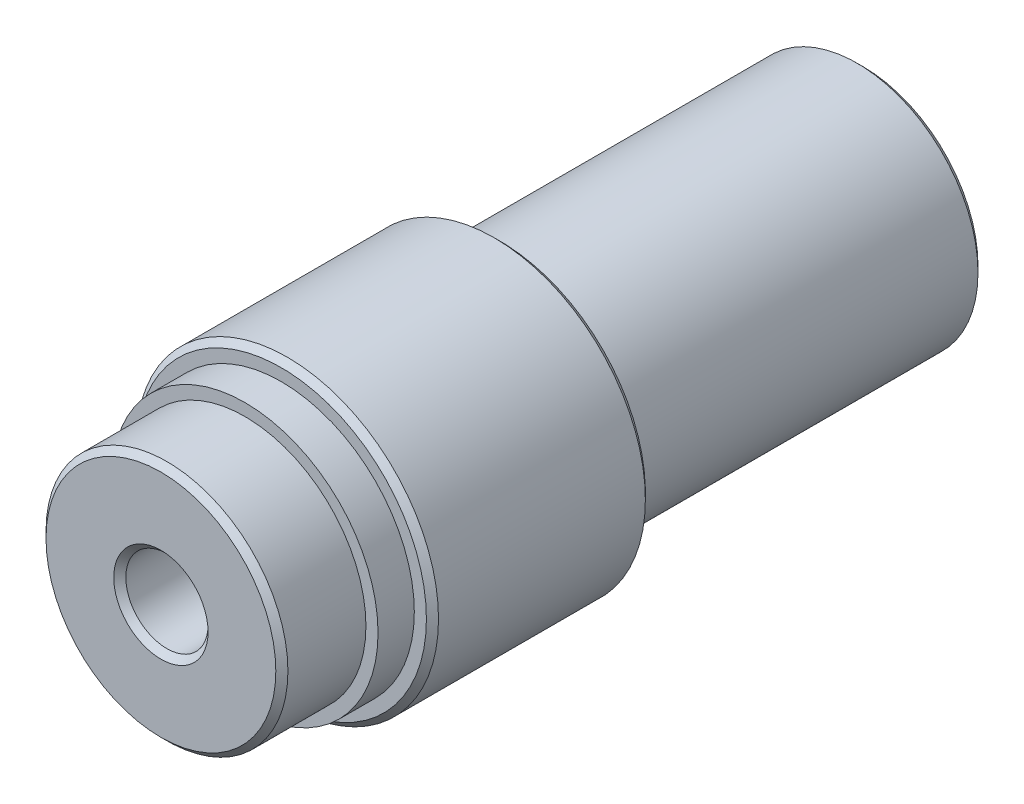
ISO-10303-21;
HEADER;
FILE_DESCRIPTION(('STEP AP214'),'2;1');
FILE_NAME('part.step','',(''),(''),'','','');
FILE_SCHEMA(('AUTOMOTIVE_DESIGN { 1 0 10303 214 1 1 1 1 }'));
ENDSEC;
DATA;
#1=APPLICATION_CONTEXT('core data for automotive mechanical design processes');
#2=APPLICATION_PROTOCOL_DEFINITION('international standard','automotive_design',2000,#1);
#3=PRODUCT_CONTEXT('',#1,'mechanical');
#4=PRODUCT('Part','Part','',(#3));
#5=PRODUCT_RELATED_PRODUCT_CATEGORY('part','',(#4));
#6=PRODUCT_DEFINITION_FORMATION('','',#4);
#7=PRODUCT_DEFINITION_CONTEXT('part definition',#1,'design');
#8=PRODUCT_DEFINITION('design','',#6,#7);
#9=PRODUCT_DEFINITION_SHAPE('','',#8);
#10=(LENGTH_UNIT() NAMED_UNIT(*) SI_UNIT(.MILLI.,.METRE.));
#11=(NAMED_UNIT(*) PLANE_ANGLE_UNIT() SI_UNIT($,.RADIAN.));
#12=(NAMED_UNIT(*) SI_UNIT($,.STERADIAN.) SOLID_ANGLE_UNIT());
#13=UNCERTAINTY_MEASURE_WITH_UNIT(LENGTH_MEASURE(1.E-05),#10,'distance_accuracy_value','');
#14=(GEOMETRIC_REPRESENTATION_CONTEXT(3) GLOBAL_UNCERTAINTY_ASSIGNED_CONTEXT((#13)) GLOBAL_UNIT_ASSIGNED_CONTEXT((#10,
#11,#12)) REPRESENTATION_CONTEXT('',''));
#15=CARTESIAN_POINT('',(0.,0.,0.));
#16=DIRECTION('',(0.,0.,1.));
#17=DIRECTION('',(1.,0.,0.));
#18=AXIS2_PLACEMENT_3D('',#15,#16,#17);
#19=CARTESIAN_POINT('',(0.,0.,-29.025));
#20=DIRECTION('',(0.,0.,1.));
#21=DIRECTION('',(0.,-1.,0.));
#22=AXIS2_PLACEMENT_3D('',#19,#20,#21);
#23=CYLINDRICAL_SURFACE('',#22,12.5);
#24=CARTESIAN_POINT('',(0.,0.,18.575));
#25=DIRECTION('',(0.,0.,-1.));
#26=DIRECTION('',(0.,1.,0.));
#27=AXIS2_PLACEMENT_3D('',#24,#25,#26);
#28=CIRCLE('',#27,12.5);
#29=CARTESIAN_POINT('',(0.,-12.5,18.575));
#30=VERTEX_POINT('',#29);
#31=EDGE_CURVE('E70',#30,#30,#28,.T.);
#32=CARTESIAN_POINT('',(0.,0.,1.47500000000002));
#33=DIRECTION('',(0.,0.,-1.));
#34=DIRECTION('',(0.,1.,0.));
#35=AXIS2_PLACEMENT_3D('',#32,#33,#34);
#36=CIRCLE('',#35,12.5);
#37=CARTESIAN_POINT('',(0.,-12.5,1.47500000000002));
#38=VERTEX_POINT('',#37);
#39=EDGE_CURVE('E126',#38,#38,#36,.F.);
#40=CARTESIAN_POINT('',(0.,-12.5,18.575));
#41=CARTESIAN_POINT('',(0.,-12.5,18.396875));
#42=CARTESIAN_POINT('',(0.,-12.5,18.21875));
#43=CARTESIAN_POINT('',(0.,-12.5,17.8625));
#44=CARTESIAN_POINT('',(0.,-12.5,17.684375));
#45=CARTESIAN_POINT('',(0.,-12.5,17.328125));
#46=CARTESIAN_POINT('',(0.,-12.5,17.15));
#47=CARTESIAN_POINT('',(0.,-12.5,16.79375));
#48=CARTESIAN_POINT('',(0.,-12.5,16.615625));
#49=CARTESIAN_POINT('',(0.,-12.5,16.259375));
#50=CARTESIAN_POINT('',(0.,-12.5,16.08125));
#51=CARTESIAN_POINT('',(0.,-12.5,15.725));
#52=CARTESIAN_POINT('',(0.,-12.5,15.546875));
#53=CARTESIAN_POINT('',(0.,-12.5,15.190625));
#54=CARTESIAN_POINT('',(0.,-12.5,15.0125));
#55=CARTESIAN_POINT('',(0.,-12.5,14.65625));
#56=CARTESIAN_POINT('',(0.,-12.5,14.478125));
#57=CARTESIAN_POINT('',(0.,-12.5,14.121875));
#58=CARTESIAN_POINT('',(0.,-12.5,13.94375));
#59=CARTESIAN_POINT('',(0.,-12.5,13.5875));
#60=CARTESIAN_POINT('',(0.,-12.5,13.409375));
#61=CARTESIAN_POINT('',(0.,-12.5,13.053125));
#62=CARTESIAN_POINT('',(0.,-12.5,12.875));
#63=CARTESIAN_POINT('',(0.,-12.5,12.51875));
#64=CARTESIAN_POINT('',(0.,-12.5,12.340625));
#65=CARTESIAN_POINT('',(0.,-12.5,11.984375));
#66=CARTESIAN_POINT('',(0.,-12.5,11.80625));
#67=CARTESIAN_POINT('',(0.,-12.5,11.45));
#68=CARTESIAN_POINT('',(0.,-12.5,11.271875));
#69=CARTESIAN_POINT('',(0.,-12.5,10.915625));
#70=CARTESIAN_POINT('',(0.,-12.5,10.7375));
#71=CARTESIAN_POINT('',(0.,-12.5,10.38125));
#72=CARTESIAN_POINT('',(0.,-12.5,10.203125));
#73=CARTESIAN_POINT('',(0.,-12.5,9.84687499999999));
#74=CARTESIAN_POINT('',(0.,-12.5,9.66875));
#75=CARTESIAN_POINT('',(0.,-12.5,9.3125));
#76=CARTESIAN_POINT('',(0.,-12.5,9.134375));
#77=CARTESIAN_POINT('',(0.,-12.5,8.778125));
#78=CARTESIAN_POINT('',(0.,-12.5,8.6));
#79=CARTESIAN_POINT('',(0.,-12.5,8.24375));
#80=CARTESIAN_POINT('',(0.,-12.5,8.065625));
#81=CARTESIAN_POINT('',(0.,-12.5,7.709375));
#82=CARTESIAN_POINT('',(0.,-12.5,7.53125));
#83=CARTESIAN_POINT('',(0.,-12.5,7.175));
#84=CARTESIAN_POINT('',(0.,-12.5,6.996875));
#85=CARTESIAN_POINT('',(0.,-12.5,6.640625));
#86=CARTESIAN_POINT('',(0.,-12.5,6.4625));
#87=CARTESIAN_POINT('',(0.,-12.5,6.10625));
#88=CARTESIAN_POINT('',(0.,-12.5,5.928125));
#89=CARTESIAN_POINT('',(0.,-12.5,5.57187500000001));
#90=CARTESIAN_POINT('',(0.,-12.5,5.39375000000001));
#91=CARTESIAN_POINT('',(0.,-12.5,5.03750000000001));
#92=CARTESIAN_POINT('',(0.,-12.5,4.85937500000001));
#93=CARTESIAN_POINT('',(0.,-12.5,4.50312500000001));
#94=CARTESIAN_POINT('',(0.,-12.5,4.32500000000001));
#95=CARTESIAN_POINT('',(0.,-12.5,3.96875000000001));
#96=CARTESIAN_POINT('',(0.,-12.5,3.79062500000001));
#97=CARTESIAN_POINT('',(0.,-12.5,3.43437500000001));
#98=CARTESIAN_POINT('',(0.,-12.5,3.25625000000001));
#99=CARTESIAN_POINT('',(0.,-12.5,2.90000000000001));
#100=CARTESIAN_POINT('',(0.,-12.5,2.72187500000001));
#101=CARTESIAN_POINT('',(0.,-12.5,2.36562500000001));
#102=CARTESIAN_POINT('',(0.,-12.5,2.18750000000002));
#103=CARTESIAN_POINT('',(0.,-12.5,1.83125000000002));
#104=CARTESIAN_POINT('',(0.,-12.5,1.65312500000002));
#105=CARTESIAN_POINT('',(0.,-12.5,1.47500000000002));
#106=B_SPLINE_CURVE_WITH_KNOTS('',3,(#40,#41,#42,#43,#44,#45,#46,#47,#48,#49,#50,#51,#52,#53,
#54,#55,#56,#57,#58,#59,#60,#61,#62,#63,#64,#65,#66,#67,#68,#69,#70,#71,#72,#73,#74,#75,#76,#77,
#78,#79,#80,#81,#82,#83,#84,#85,#86,#87,#88,#89,#90,#91,#92,#93,#94,#95,#96,#97,#98,#99,#100,
#101,#102,#103,#104,#105),.UNSPECIFIED.,.F.,.F.,(4,2,2,2,2,2,2,2,2,2,2,2,2,2,2,2,2,2,2,2,2,2,2,
2,2,2,2,2,2,2,2,2,4),(0.,0.534374999999997,1.06874999999999,1.603125,2.13749999999999,
2.67187499999999,3.20624999999999,3.74062499999999,4.27499999999999,4.80937499999998,
5.34374999999998,5.87812499999998,6.41249999999998,6.94687499999998,7.48124999999998,
8.01562499999998,8.54999999999997,9.08437499999997,9.61874999999997,10.153125,10.6875,11.221875,
11.75625,12.290625,12.825,13.359375,13.89375,14.428125,14.9625,15.496875,16.03125,
16.5656249999999,17.0999999999999),.UNSPECIFIED.);
#107=EDGE_CURVE('BSEAM61',#30,#38,#106,.T.);
#108=ORIENTED_EDGE('',*,*,#31,.T.);
#109=ORIENTED_EDGE('',*,*,#39,.T.);
#110=ORIENTED_EDGE('',*,*,#107,.T.);
#111=ORIENTED_EDGE('',*,*,#107,.F.);
#112=EDGE_LOOP('',(#108,#110,#109,#111));
#113=FACE_BOUND('',#112,.T.);
#114=ADVANCED_FACE('F61',(#113),#23,.T.);
#115=CARTESIAN_POINT('',(0.,0.,-29.025));
#116=DIRECTION('',(0.,0.,1.));
#117=DIRECTION('',(1.,0.,0.));
#118=AXIS2_PLACEMENT_3D('',#115,#116,#117);
#119=CYLINDRICAL_SURFACE('',#118,10.);
#120=CARTESIAN_POINT('',(0.,0.,-28.525));
#121=DIRECTION('',(0.,0.,-1.));
#122=DIRECTION('',(-1.,0.,0.));
#123=AXIS2_PLACEMENT_3D('',#120,#121,#122);
#124=CIRCLE('',#123,10.);
#125=CARTESIAN_POINT('',(-10.,0.,-28.525));
#126=VERTEX_POINT('',#125);
#127=EDGE_CURVE('E100',#126,#126,#124,.F.);
#128=ORIENTED_EDGE('',*,*,#127,.T.);
#129=EDGE_LOOP('',(#128));
#130=FACE_BOUND('',#129,.T.);
#131=CARTESIAN_POINT('',(0.,0.,0.975000000000004));
#132=DIRECTION('',(0.,0.,1.));
#133=DIRECTION('',(1.,0.,0.));
#134=AXIS2_PLACEMENT_3D('',#131,#132,#133);
#135=CIRCLE('',#134,10.);
#136=CARTESIAN_POINT('',(10.,0.,0.975000000000004));
#137=VERTEX_POINT('',#136);
#138=EDGE_CURVE('E97',#137,#137,#135,.T.);
#139=ORIENTED_EDGE('',*,*,#138,.F.);
#140=EDGE_LOOP('',(#139));
#141=FACE_BOUND('',#140,.T.);
#142=ADVANCED_FACE('F147',(#130,#141),#119,.T.);
#143=CARTESIAN_POINT('',(0.,12.5,0.975000000000004));
#144=DIRECTION('',(0.,0.,-1.));
#145=DIRECTION('',(-1.,0.,0.));
#146=AXIS2_PLACEMENT_3D('',#143,#144,#145);
#147=PLANE('',#146);
#148=CARTESIAN_POINT('',(0.,0.,0.975000000000004));
#149=DIRECTION('',(0.,0.,-1.));
#150=DIRECTION('',(-1.,0.,0.));
#151=AXIS2_PLACEMENT_3D('',#148,#149,#150);
#152=CIRCLE('',#151,12.);
#153=CARTESIAN_POINT('',(-12.,0.,0.975000000000004));
#154=VERTEX_POINT('',#153);
#155=EDGE_CURVE('E129',#154,#154,#152,.T.);
#156=ORIENTED_EDGE('',*,*,#155,.T.);
#157=EDGE_LOOP('',(#156));
#158=FACE_BOUND('',#157,.T.);
#159=ORIENTED_EDGE('',*,*,#138,.T.);
#160=EDGE_LOOP('',(#159));
#161=FACE_BOUND('',#160,.T.);
#162=ADVANCED_FACE('F152',(#158,#161),#147,.T.);
#163=CARTESIAN_POINT('',(0.,0.,-29.025));
#164=DIRECTION('',(0.,0.,-1.));
#165=DIRECTION('',(0.,1.,0.));
#166=AXIS2_PLACEMENT_3D('',#163,#164,#165);
#167=PLANE('',#166);
#168=CARTESIAN_POINT('',(0.,0.,-29.025));
#169=DIRECTION('',(0.,0.,-1.));
#170=DIRECTION('',(0.,1.,0.));
#171=AXIS2_PLACEMENT_3D('',#168,#169,#170);
#172=CIRCLE('',#171,9.5);
#173=CARTESIAN_POINT('',(0.,9.5,-29.025));
#174=VERTEX_POINT('',#173);
#175=EDGE_CURVE('E108',#174,#174,#172,.T.);
#176=ORIENTED_EDGE('',*,*,#175,.T.);
#177=EDGE_LOOP('',(#176));
#178=FACE_BOUND('',#177,.T.);
#179=CARTESIAN_POINT('',(0.,0.,-29.025));
#180=DIRECTION('',(0.,0.,-1.));
#181=DIRECTION('',(0.,1.,0.));
#182=AXIS2_PLACEMENT_3D('',#179,#180,#181);
#183=CIRCLE('',#182,3.9);
#184=CARTESIAN_POINT('',(0.,3.89999999999999,-29.025));
#185=VERTEX_POINT('',#184);
#186=EDGE_CURVE('E105',#185,#185,#183,.F.);
#187=ORIENTED_EDGE('',*,*,#186,.T.);
#188=EDGE_LOOP('',(#187));
#189=FACE_BOUND('',#188,.T.);
#190=ADVANCED_FACE('F80',(#178,#189),#167,.T.);
#191=CARTESIAN_POINT('',(0.,0.,-6.775));
#192=DIRECTION('',(0.,0.,-1.));
#193=DIRECTION('',(-1.,0.,0.));
#194=AXIS2_PLACEMENT_3D('',#191,#192,#193);
#195=CONICAL_SURFACE('',#194,3.4,1.02974425867665);
#196=CARTESIAN_POINT('',(0.,0.,-4.73207389530629));
#197=VERTEX_POINT('',#196);
#198=VERTEX_LOOP('',#197);
#199=FACE_BOUND('',#198,.T.);
#200=CARTESIAN_POINT('',(0.,0.,-6.775));
#201=DIRECTION('',(0.,0.,-1.));
#202=DIRECTION('',(-1.,0.,0.));
#203=AXIS2_PLACEMENT_3D('',#200,#201,#202);
#204=CIRCLE('',#203,3.4);
#205=CARTESIAN_POINT('',(-3.4,0.,-6.775));
#206=VERTEX_POINT('',#205);
#207=EDGE_CURVE('E84',#206,#206,#204,.T.);
#208=ORIENTED_EDGE('',*,*,#207,.T.);
#209=EDGE_LOOP('',(#208));
#210=FACE_BOUND('',#209,.T.);
#211=ADVANCED_FACE('F76',(#199,#210),#195,.F.);
#212=CARTESIAN_POINT('',(0.,0.,-29.025));
#213=DIRECTION('',(0.,0.,-1.));
#214=DIRECTION('',(-1.,0.,0.));
#215=AXIS2_PLACEMENT_3D('',#212,#213,#214);
#216=CYLINDRICAL_SURFACE('',#215,3.4);
#217=CARTESIAN_POINT('',(0.,0.,-28.525));
#218=DIRECTION('',(0.,0.,-1.));
#219=DIRECTION('',(-1.,0.,0.));
#220=AXIS2_PLACEMENT_3D('',#217,#218,#219);
#221=CIRCLE('',#220,3.4);
#222=CARTESIAN_POINT('',(-3.4,0.,-28.525));
#223=VERTEX_POINT('',#222);
#224=EDGE_CURVE('E111',#223,#223,#221,.T.);
#225=ORIENTED_EDGE('',*,*,#224,.T.);
#226=EDGE_LOOP('',(#225));
#227=FACE_BOUND('',#226,.T.);
#228=ORIENTED_EDGE('',*,*,#207,.F.);
#229=EDGE_LOOP('',(#228));
#230=FACE_BOUND('',#229,.T.);
#231=ADVANCED_FACE('F79',(#227,#230),#216,.F.);
#232=CARTESIAN_POINT('',(0.,0.,-28.525));
#233=DIRECTION('',(0.,0.,1.));
#234=DIRECTION('',(1.,0.,0.));
#235=AXIS2_PLACEMENT_3D('',#232,#233,#234);
#236=CONICAL_SURFACE('',#235,10.,0.78539816339745);
#237=ORIENTED_EDGE('',*,*,#175,.F.);
#238=EDGE_LOOP('',(#237));
#239=FACE_BOUND('',#238,.T.);
#240=ORIENTED_EDGE('',*,*,#127,.F.);
#241=EDGE_LOOP('',(#240));
#242=FACE_BOUND('',#241,.T.);
#243=ADVANCED_FACE('F160',(#239,#242),#236,.T.);
#244=CARTESIAN_POINT('',(0.,0.,-28.525));
#245=DIRECTION('',(0.,0.,-1.));
#246=DIRECTION('',(-1.,0.,0.));
#247=AXIS2_PLACEMENT_3D('',#244,#245,#246);
#248=CONICAL_SURFACE('',#247,3.4,0.785398163397451);
#249=ORIENTED_EDGE('',*,*,#186,.F.);
#250=EDGE_LOOP('',(#249));
#251=FACE_BOUND('',#250,.T.);
#252=ORIENTED_EDGE('',*,*,#224,.F.);
#253=EDGE_LOOP('',(#252));
#254=FACE_BOUND('',#253,.T.);
#255=ADVANCED_FACE('F166',(#251,#254),#248,.F.);
#256=CARTESIAN_POINT('',(0.,0.,1.47500000000002));
#257=DIRECTION('',(0.,0.,1.));
#258=DIRECTION('',(0.,-1.,0.));
#259=AXIS2_PLACEMENT_3D('',#256,#257,#258);
#260=CONICAL_SURFACE('',#259,12.5,0.785398163397452);
#261=ORIENTED_EDGE('',*,*,#155,.F.);
#262=EDGE_LOOP('',(#261));
#263=FACE_BOUND('',#262,.T.);
#264=ORIENTED_EDGE('',*,*,#39,.F.);
#265=EDGE_LOOP('',(#264));
#266=FACE_BOUND('',#265,.T.);
#267=ADVANCED_FACE('F173',(#263,#266),#260,.T.);
#268=CARTESIAN_POINT('',(0.,11.,19.075));
#269=DIRECTION('',(0.,0.,-1.));
#270=DIRECTION('',(-1.,0.,0.));
#271=AXIS2_PLACEMENT_3D('',#268,#269,#270);
#272=PLANE('',#271);
#273=CARTESIAN_POINT('',(0.,0.,19.075));
#274=DIRECTION('',(0.,0.,-1.));
#275=DIRECTION('',(-1.,0.,0.));
#276=AXIS2_PLACEMENT_3D('',#273,#274,#275);
#277=CIRCLE('',#276,12.);
#278=CARTESIAN_POINT('',(-12.,0.,19.075));
#279=VERTEX_POINT('',#278);
#280=EDGE_CURVE('E14',#279,#279,#277,.F.);
#281=ORIENTED_EDGE('',*,*,#280,.T.);
#282=EDGE_LOOP('',(#281));
#283=FACE_BOUND('',#282,.T.);
#284=CARTESIAN_POINT('',(0.,0.,19.075));
#285=DIRECTION('',(0.,0.,-1.));
#286=DIRECTION('',(-1.,0.,0.));
#287=AXIS2_PLACEMENT_3D('',#284,#285,#286);
#288=CIRCLE('',#287,11.);
#289=CARTESIAN_POINT('',(-11.,0.,19.075));
#290=VERTEX_POINT('',#289);
#291=EDGE_CURVE('E87',#290,#290,#288,.T.);
#292=ORIENTED_EDGE('',*,*,#291,.T.);
#293=EDGE_LOOP('',(#292));
#294=FACE_BOUND('',#293,.T.);
#295=ADVANCED_FACE('F192',(#283,#294),#272,.F.);
#296=CARTESIAN_POINT('',(0.,0.,29.025));
#297=DIRECTION('',(0.,0.,-1.));
#298=DIRECTION('',(-1.,0.,0.));
#299=AXIS2_PLACEMENT_3D('',#296,#297,#298);
#300=CYLINDRICAL_SURFACE('',#299,11.);
#301=ORIENTED_EDGE('',*,*,#291,.F.);
#302=EDGE_LOOP('',(#301));
#303=FACE_BOUND('',#302,.T.);
#304=CARTESIAN_POINT('',(0.,0.,22.075));
#305=DIRECTION('',(0.,0.,-1.));
#306=DIRECTION('',(-1.,0.,0.));
#307=AXIS2_PLACEMENT_3D('',#304,#305,#306);
#308=CIRCLE('',#307,11.);
#309=CARTESIAN_POINT('',(-11.,0.,22.075));
#310=VERTEX_POINT('',#309);
#311=EDGE_CURVE('E93',#310,#310,#308,.T.);
#312=ORIENTED_EDGE('',*,*,#311,.T.);
#313=EDGE_LOOP('',(#312));
#314=FACE_BOUND('',#313,.T.);
#315=ADVANCED_FACE('F197',(#303,#314),#300,.T.);
#316=CARTESIAN_POINT('',(0.,0.,6.775));
#317=DIRECTION('',(0.,0.,1.));
#318=DIRECTION('',(1.,0.,0.));
#319=AXIS2_PLACEMENT_3D('',#316,#317,#318);
#320=CONICAL_SURFACE('',#319,3.4,1.02974425867665);
#321=CARTESIAN_POINT('',(0.,0.,4.73207389530629));
#322=VERTEX_POINT('',#321);
#323=VERTEX_LOOP('',#322);
#324=FACE_BOUND('',#323,.T.);
#325=CARTESIAN_POINT('',(0.,0.,6.775));
#326=DIRECTION('',(0.,0.,1.));
#327=DIRECTION('',(1.,0.,0.));
#328=AXIS2_PLACEMENT_3D('',#325,#326,#327);
#329=CIRCLE('',#328,3.4);
#330=CARTESIAN_POINT('',(3.4,0.,6.775));
#331=VERTEX_POINT('',#330);
#332=EDGE_CURVE('E86',#331,#331,#329,.T.);
#333=ORIENTED_EDGE('',*,*,#332,.T.);
#334=EDGE_LOOP('',(#333));
#335=FACE_BOUND('',#334,.T.);
#336=ADVANCED_FACE('F214',(#324,#335),#320,.F.);
#337=CARTESIAN_POINT('',(0.,0.,29.025));
#338=DIRECTION('',(0.,0.,1.));
#339=DIRECTION('',(1.,0.,0.));
#340=AXIS2_PLACEMENT_3D('',#337,#338,#339);
#341=CYLINDRICAL_SURFACE('',#340,3.4);
#342=CARTESIAN_POINT('',(0.,0.,28.525));
#343=DIRECTION('',(0.,0.,-1.));
#344=DIRECTION('',(-1.,0.,0.));
#345=AXIS2_PLACEMENT_3D('',#342,#343,#344);
#346=CIRCLE('',#345,3.4);
#347=CARTESIAN_POINT('',(-3.4,0.,28.525));
#348=VERTEX_POINT('',#347);
#349=EDGE_CURVE('E123',#348,#348,#346,.F.);
#350=ORIENTED_EDGE('',*,*,#349,.T.);
#351=EDGE_LOOP('',(#350));
#352=FACE_BOUND('',#351,.T.);
#353=ORIENTED_EDGE('',*,*,#332,.F.);
#354=EDGE_LOOP('',(#353));
#355=FACE_BOUND('',#354,.T.);
#356=ADVANCED_FACE('F187',(#352,#355),#341,.F.);
#357=CARTESIAN_POINT('',(0.,0.,28.525));
#358=DIRECTION('',(0.,0.,1.));
#359=DIRECTION('',(1.,0.,0.));
#360=AXIS2_PLACEMENT_3D('',#357,#358,#359);
#361=CONICAL_SURFACE('',#360,3.4,0.785398163397451);
#362=CARTESIAN_POINT('',(0.,0.,29.025));
#363=DIRECTION('',(0.,0.,-1.));
#364=DIRECTION('',(0.,1.,0.));
#365=AXIS2_PLACEMENT_3D('',#362,#363,#364);
#366=CIRCLE('',#365,3.9);
#367=CARTESIAN_POINT('',(0.,3.89999999999999,29.025));
#368=VERTEX_POINT('',#367);
#369=EDGE_CURVE('E114',#368,#368,#366,.T.);
#370=ORIENTED_EDGE('',*,*,#369,.F.);
#371=EDGE_LOOP('',(#370));
#372=FACE_BOUND('',#371,.T.);
#373=ORIENTED_EDGE('',*,*,#349,.F.);
#374=EDGE_LOOP('',(#373));
#375=FACE_BOUND('',#374,.T.);
#376=ADVANCED_FACE('F182',(#372,#375),#361,.F.);
#377=CARTESIAN_POINT('',(0.,0.,29.025));
#378=DIRECTION('',(0.,0.,-1.));
#379=DIRECTION('',(0.,1.,0.));
#380=AXIS2_PLACEMENT_3D('',#377,#378,#379);
#381=PLANE('',#380);
#382=CARTESIAN_POINT('',(0.,0.,29.025));
#383=DIRECTION('',(0.,0.,-1.));
#384=DIRECTION('',(0.,1.,0.));
#385=AXIS2_PLACEMENT_3D('',#382,#383,#384);
#386=CIRCLE('',#385,9.49999999999997);
#387=CARTESIAN_POINT('',(0.,9.49999999999997,29.025));
#388=VERTEX_POINT('',#387);
#389=EDGE_CURVE('E117',#388,#388,#386,.F.);
#390=ORIENTED_EDGE('',*,*,#389,.T.);
#391=EDGE_LOOP('',(#390));
#392=FACE_BOUND('',#391,.T.);
#393=ORIENTED_EDGE('',*,*,#369,.T.);
#394=EDGE_LOOP('',(#393));
#395=FACE_BOUND('',#394,.T.);
#396=ADVANCED_FACE('F157',(#392,#395),#381,.F.);
#397=CARTESIAN_POINT('',(0.,0.,29.025));
#398=DIRECTION('',(0.,0.,-1.));
#399=DIRECTION('',(-1.,0.,0.));
#400=AXIS2_PLACEMENT_3D('',#397,#398,#399);
#401=CONICAL_SURFACE('',#400,9.49999999999998,0.785398163397454);
#402=CARTESIAN_POINT('',(0.,0.,28.525));
#403=DIRECTION('',(0.,0.,-1.));
#404=DIRECTION('',(-1.,0.,0.));
#405=AXIS2_PLACEMENT_3D('',#402,#403,#404);
#406=CIRCLE('',#405,9.99999999999999);
#407=CARTESIAN_POINT('',(-9.99999999999999,0.,28.525));
#408=VERTEX_POINT('',#407);
#409=EDGE_CURVE('E120',#408,#408,#406,.T.);
#410=ORIENTED_EDGE('',*,*,#409,.F.);
#411=EDGE_LOOP('',(#410));
#412=FACE_BOUND('',#411,.T.);
#413=ORIENTED_EDGE('',*,*,#389,.F.);
#414=EDGE_LOOP('',(#413));
#415=FACE_BOUND('',#414,.T.);
#416=ADVANCED_FACE('F175',(#412,#415),#401,.T.);
#417=CARTESIAN_POINT('',(0.,0.,-29.025));
#418=DIRECTION('',(0.,0.,1.));
#419=DIRECTION('',(1.,0.,0.));
#420=AXIS2_PLACEMENT_3D('',#417,#418,#419);
#421=CYLINDRICAL_SURFACE('',#420,9.99999999999999);
#422=ORIENTED_EDGE('',*,*,#409,.T.);
#423=EDGE_LOOP('',(#422));
#424=FACE_BOUND('',#423,.T.);
#425=CARTESIAN_POINT('',(0.,0.,22.075));
#426=DIRECTION('',(0.,0.,1.));
#427=DIRECTION('',(1.,0.,0.));
#428=AXIS2_PLACEMENT_3D('',#425,#426,#427);
#429=CIRCLE('',#428,9.99999999999999);
#430=CARTESIAN_POINT('',(9.99999999999999,0.,22.075));
#431=VERTEX_POINT('',#430);
#432=EDGE_CURVE('E90',#431,#431,#429,.T.);
#433=ORIENTED_EDGE('',*,*,#432,.T.);
#434=EDGE_LOOP('',(#433));
#435=FACE_BOUND('',#434,.T.);
#436=ADVANCED_FACE('F142',(#424,#435),#421,.T.);
#437=CARTESIAN_POINT('',(0.,12.5,22.075));
#438=DIRECTION('',(0.,0.,1.));
#439=DIRECTION('',(1.,0.,0.));
#440=AXIS2_PLACEMENT_3D('',#437,#438,#439);
#441=PLANE('',#440);
#442=ORIENTED_EDGE('',*,*,#311,.F.);
#443=EDGE_LOOP('',(#442));
#444=FACE_BOUND('',#443,.T.);
#445=ORIENTED_EDGE('',*,*,#432,.F.);
#446=EDGE_LOOP('',(#445));
#447=FACE_BOUND('',#446,.T.);
#448=ADVANCED_FACE('F137',(#444,#447),#441,.T.);
#449=CARTESIAN_POINT('',(0.,0.,18.575));
#450=DIRECTION('',(0.,0.,-1.));
#451=DIRECTION('',(0.,1.,0.));
#452=AXIS2_PLACEMENT_3D('',#449,#450,#451);
#453=CONICAL_SURFACE('',#452,12.5,0.785398163397453);
#454=ORIENTED_EDGE('',*,*,#280,.F.);
#455=EDGE_LOOP('',(#454));
#456=FACE_BOUND('',#455,.T.);
#457=ORIENTED_EDGE('',*,*,#31,.F.);
#458=EDGE_LOOP('',(#457));
#459=FACE_BOUND('',#458,.T.);
#460=ADVANCED_FACE('F64',(#456,#459),#453,.T.);
#461=CLOSED_SHELL('',(#114,#142,#162,#190,#211,#231,#243,#255,#267,#295,#315,#336,#356,#376,
#396,#416,#436,#448,#460));
#462=MANIFOLD_SOLID_BREP('B2',#461);
#463=ADVANCED_BREP_SHAPE_REPRESENTATION('',(#18,#462),#14);
#464=SHAPE_DEFINITION_REPRESENTATION(#9,#463);
ENDSEC;
END-ISO-10303-21;
